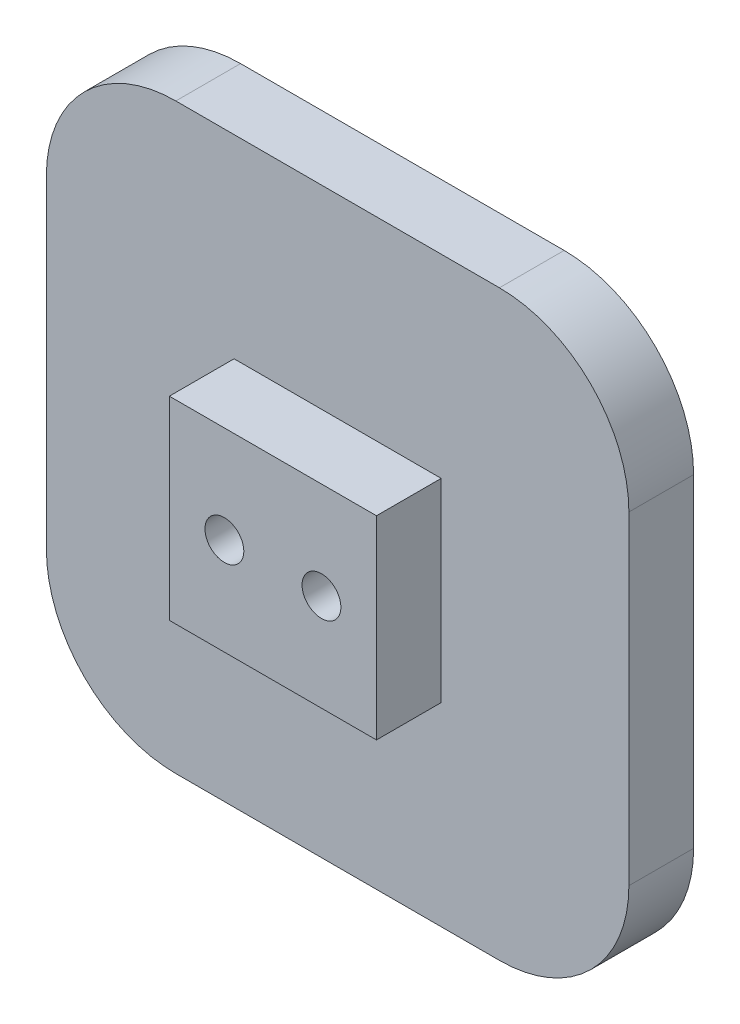
ISO-10303-21;
HEADER;
FILE_DESCRIPTION(('STEP AP214'),'2;1');
FILE_NAME('part.step','',(''),(''),'','','');
FILE_SCHEMA(('AUTOMOTIVE_DESIGN { 1 0 10303 214 1 1 1 1 }'));
ENDSEC;
DATA;
#1=APPLICATION_CONTEXT('core data for automotive mechanical design processes');
#2=APPLICATION_PROTOCOL_DEFINITION('international standard','automotive_design',2000,#1);
#3=PRODUCT_CONTEXT('',#1,'mechanical');
#4=PRODUCT('Part','Part','',(#3));
#5=PRODUCT_RELATED_PRODUCT_CATEGORY('part','',(#4));
#6=PRODUCT_DEFINITION_FORMATION('','',#4);
#7=PRODUCT_DEFINITION_CONTEXT('part definition',#1,'design');
#8=PRODUCT_DEFINITION('design','',#6,#7);
#9=PRODUCT_DEFINITION_SHAPE('','',#8);
#10=(LENGTH_UNIT() NAMED_UNIT(*) SI_UNIT(.MILLI.,.METRE.));
#11=(NAMED_UNIT(*) PLANE_ANGLE_UNIT() SI_UNIT($,.RADIAN.));
#12=(NAMED_UNIT(*) SI_UNIT($,.STERADIAN.) SOLID_ANGLE_UNIT());
#13=UNCERTAINTY_MEASURE_WITH_UNIT(LENGTH_MEASURE(1.E-05),#10,'distance_accuracy_value','');
#14=(GEOMETRIC_REPRESENTATION_CONTEXT(3) GLOBAL_UNCERTAINTY_ASSIGNED_CONTEXT((#13)) GLOBAL_UNIT_ASSIGNED_CONTEXT((#10,
#11,#12)) REPRESENTATION_CONTEXT('',''));
#15=CARTESIAN_POINT('',(0.,0.,0.));
#16=DIRECTION('',(0.,0.,1.));
#17=DIRECTION('',(1.,0.,0.));
#18=AXIS2_PLACEMENT_3D('',#15,#16,#17);
#19=CARTESIAN_POINT('',(-12.5413669644873,38.8891123439667,27.));
#20=DIRECTION('',(0.,1.,0.));
#21=DIRECTION('',(0.,0.,1.));
#22=AXIS2_PLACEMENT_3D('',#19,#20,#21);
#23=PLANE('',#22);
#24=DIRECTION('',(0.,0.,-1.));
#25=VECTOR('',#24,1.);
#26=CARTESIAN_POINT('',(19.4586330355127,38.8891123439667,27.));
#27=LINE('',#26,#25);
#28=CARTESIAN_POINT('',(19.4586330355127,38.8891123439667,20.));
#29=VERTEX_POINT('',#28);
#30=CARTESIAN_POINT('',(19.4586330355127,38.8891123439667,10.));
#31=VERTEX_POINT('',#30);
#32=EDGE_CURVE('E247',#29,#31,#27,.T.);
#33=ORIENTED_EDGE('',*,*,#32,.T.);
#34=DIRECTION('',(1.,0.,0.));
#35=VECTOR('',#34,1.);
#36=CARTESIAN_POINT('',(-12.5413669644873,38.8891123439667,10.));
#37=LINE('',#36,#35);
#38=CARTESIAN_POINT('',(-12.5413669644873,38.8891123439667,10.));
#39=VERTEX_POINT('',#38);
#40=EDGE_CURVE('E130',#39,#31,#37,.T.);
#41=ORIENTED_EDGE('',*,*,#40,.F.);
#42=DIRECTION('',(0.,0.,-1.));
#43=VECTOR('',#42,1.);
#44=CARTESIAN_POINT('',(-12.5413669644873,38.8891123439667,27.));
#45=LINE('',#44,#43);
#46=CARTESIAN_POINT('',(-12.5413669644873,38.8891123439667,20.));
#47=VERTEX_POINT('',#46);
#48=EDGE_CURVE('E249',#47,#39,#45,.T.);
#49=ORIENTED_EDGE('',*,*,#48,.F.);
#50=DIRECTION('',(1.,0.,0.));
#51=VECTOR('',#50,1.);
#52=CARTESIAN_POINT('',(28.4586330355127,38.8891123439667,20.));
#53=LINE('',#52,#51);
#54=EDGE_CURVE('E252',#47,#29,#53,.T.);
#55=ORIENTED_EDGE('',*,*,#54,.T.);
#56=EDGE_LOOP('',(#33,#41,#49,#55));
#57=FACE_BOUND('',#56,.T.);
#58=ADVANCED_FACE('F33',(#57),#23,.T.);
#59=CARTESIAN_POINT('',(28.4586330355127,48.8891123439667,0.));
#60=DIRECTION('',(0.,0.,-1.));
#61=DIRECTION('',(-1.,0.,0.));
#62=AXIS2_PLACEMENT_3D('',#59,#60,#61);
#63=PLANE('',#62);
#64=CARTESIAN_POINT('',(-4.04136696448732,23.8891123439667,0.));
#65=DIRECTION('',(0.,0.,1.));
#66=DIRECTION('',(1.,0.,0.));
#67=AXIS2_PLACEMENT_3D('',#64,#65,#66);
#68=CIRCLE('',#67,6.);
#69=CARTESIAN_POINT('',(1.95863303551269,23.8891123439667,0.));
#70=VERTEX_POINT('',#69);
#71=EDGE_CURVE('E187',#70,#70,#68,.T.);
#72=ORIENTED_EDGE('',*,*,#71,.T.);
#73=EDGE_LOOP('',(#72));
#74=FACE_BOUND('',#73,.T.);
#75=CARTESIAN_POINT('',(10.9586330355127,23.8891123439667,0.));
#76=DIRECTION('',(0.,0.,1.));
#77=DIRECTION('',(1.,0.,0.));
#78=AXIS2_PLACEMENT_3D('',#75,#76,#77);
#79=CIRCLE('',#78,6.);
#80=CARTESIAN_POINT('',(16.9586330355127,23.8891123439667,0.));
#81=VERTEX_POINT('',#80);
#82=EDGE_CURVE('E180',#81,#81,#79,.T.);
#83=ORIENTED_EDGE('',*,*,#82,.T.);
#84=EDGE_LOOP('',(#83));
#85=FACE_BOUND('',#84,.T.);
#86=CARTESIAN_POINT('',(28.4586330355126,-1.11088765603327,0.));
#87=DIRECTION('',(0.,0.,-1.));
#88=DIRECTION('',(1.,0.,0.));
#89=AXIS2_PLACEMENT_3D('',#86,#87,#88);
#90=CIRCLE('',#89,20.);
#91=CARTESIAN_POINT('',(48.4586330355126,-1.11088765603329,0.));
#92=VERTEX_POINT('',#91);
#93=CARTESIAN_POINT('',(28.4586330355126,-21.1108876560333,0.));
#94=VERTEX_POINT('',#93);
#95=EDGE_CURVE('E200',#92,#94,#90,.T.);
#96=ORIENTED_EDGE('',*,*,#95,.T.);
#97=DIRECTION('',(1.,0.,0.));
#98=VECTOR('',#97,1.);
#99=CARTESIAN_POINT('',(-21.5413669644873,-21.1108876560332,0.));
#100=LINE('',#99,#98);
#101=CARTESIAN_POINT('',(-21.5413669644874,-21.1108876560332,0.));
#102=VERTEX_POINT('',#101);
#103=EDGE_CURVE('E42',#102,#94,#100,.T.);
#104=ORIENTED_EDGE('',*,*,#103,.F.);
#105=CARTESIAN_POINT('',(-21.5413669644873,-1.11088765603323,0.));
#106=DIRECTION('',(0.,0.,-1.));
#107=DIRECTION('',(-1.,0.,0.));
#108=AXIS2_PLACEMENT_3D('',#105,#106,#107);
#109=CIRCLE('',#108,20.);
#110=CARTESIAN_POINT('',(-41.5413669644873,-1.11088765603322,0.));
#111=VERTEX_POINT('',#110);
#112=EDGE_CURVE('E140',#102,#111,#109,.T.);
#113=ORIENTED_EDGE('',*,*,#112,.T.);
#114=DIRECTION('',(0.,-1.,0.));
#115=VECTOR('',#114,1.);
#116=CARTESIAN_POINT('',(-41.5413669644873,68.8891123439667,0.));
#117=LINE('',#116,#115);
#118=CARTESIAN_POINT('',(-41.5413669644873,48.8891123439667,0.));
#119=VERTEX_POINT('',#118);
#120=EDGE_CURVE('E161',#119,#111,#117,.T.);
#121=ORIENTED_EDGE('',*,*,#120,.F.);
#122=CARTESIAN_POINT('',(-21.5413669644873,48.8891123439667,0.));
#123=DIRECTION('',(0.,0.,-1.));
#124=DIRECTION('',(1.,0.,0.));
#125=AXIS2_PLACEMENT_3D('',#122,#123,#124);
#126=CIRCLE('',#125,20.);
#127=CARTESIAN_POINT('',(-21.5413669644873,68.8891123439667,0.));
#128=VERTEX_POINT('',#127);
#129=EDGE_CURVE('E223',#119,#128,#126,.T.);
#130=ORIENTED_EDGE('',*,*,#129,.T.);
#131=DIRECTION('',(-1.,0.,0.));
#132=VECTOR('',#131,1.);
#133=CARTESIAN_POINT('',(-21.5413669644873,68.8891123439667,0.));
#134=LINE('',#133,#132);
#135=CARTESIAN_POINT('',(28.4586330355127,68.8891123439667,0.));
#136=VERTEX_POINT('',#135);
#137=EDGE_CURVE('E255',#136,#128,#134,.T.);
#138=ORIENTED_EDGE('',*,*,#137,.F.);
#139=CARTESIAN_POINT('',(28.4586330355127,48.8891123439667,0.));
#140=DIRECTION('',(0.,0.,-1.));
#141=DIRECTION('',(-1.,0.,0.));
#142=AXIS2_PLACEMENT_3D('',#139,#140,#141);
#143=CIRCLE('',#142,20.);
#144=CARTESIAN_POINT('',(48.4586330355127,48.8891123439667,0.));
#145=VERTEX_POINT('',#144);
#146=EDGE_CURVE('E211',#136,#145,#143,.T.);
#147=ORIENTED_EDGE('',*,*,#146,.T.);
#148=DIRECTION('',(0.,1.,0.));
#149=VECTOR('',#148,1.);
#150=CARTESIAN_POINT('',(48.4586330355127,68.8891123439667,0.));
#151=LINE('',#150,#149);
#152=EDGE_CURVE('E146',#92,#145,#151,.T.);
#153=ORIENTED_EDGE('',*,*,#152,.F.);
#154=EDGE_LOOP('',(#96,#104,#113,#121,#130,#138,#147,#153));
#155=FACE_BOUND('',#154,.T.);
#156=ADVANCED_FACE('F240',(#74,#85,#155),#63,.T.);
#157=CARTESIAN_POINT('',(-12.5413669644873,68.8891123439667,30.));
#158=DIRECTION('',(-1.,0.,0.));
#159=DIRECTION('',(0.,0.,1.));
#160=AXIS2_PLACEMENT_3D('',#157,#158,#159);
#161=PLANE('',#160);
#162=DIRECTION('',(0.,1.,0.));
#163=VECTOR('',#162,1.);
#164=CARTESIAN_POINT('',(-12.5413669644873,68.8891123439667,10.));
#165=LINE('',#164,#163);
#166=CARTESIAN_POINT('',(-12.5413669644873,8.88911234396675,10.));
#167=VERTEX_POINT('',#166);
#168=EDGE_CURVE('E167',#167,#39,#165,.T.);
#169=ORIENTED_EDGE('',*,*,#168,.F.);
#170=DIRECTION('',(0.,0.,-1.));
#171=VECTOR('',#170,1.);
#172=CARTESIAN_POINT('',(-12.5413669644873,8.88911234396675,28.));
#173=LINE('',#172,#171);
#174=CARTESIAN_POINT('',(-12.5413669644873,8.88911234396675,20.));
#175=VERTEX_POINT('',#174);
#176=EDGE_CURVE('E125',#175,#167,#173,.T.);
#177=ORIENTED_EDGE('',*,*,#176,.F.);
#178=DIRECTION('',(0.,1.,0.));
#179=VECTOR('',#178,1.);
#180=CARTESIAN_POINT('',(-12.5413669644873,48.8891123439667,20.));
#181=LINE('',#180,#179);
#182=EDGE_CURVE('E245',#175,#47,#181,.T.);
#183=ORIENTED_EDGE('',*,*,#182,.T.);
#184=ORIENTED_EDGE('',*,*,#48,.T.);
#185=EDGE_LOOP('',(#169,#177,#183,#184));
#186=FACE_BOUND('',#185,.T.);
#187=ADVANCED_FACE('F295',(#186),#161,.T.);
#188=CARTESIAN_POINT('',(19.4586330355127,68.8891123439667,30.));
#189=DIRECTION('',(1.,0.,0.));
#190=DIRECTION('',(0.,0.,-1.));
#191=AXIS2_PLACEMENT_3D('',#188,#189,#190);
#192=PLANE('',#191);
#193=DIRECTION('',(0.,-1.,0.));
#194=VECTOR('',#193,1.);
#195=CARTESIAN_POINT('',(19.4586330355127,48.8891123439667,20.));
#196=LINE('',#195,#194);
#197=CARTESIAN_POINT('',(19.4586330355127,8.88911234396675,20.));
#198=VERTEX_POINT('',#197);
#199=EDGE_CURVE('E139',#29,#198,#196,.T.);
#200=ORIENTED_EDGE('',*,*,#199,.T.);
#201=DIRECTION('',(0.,0.,-1.));
#202=VECTOR('',#201,1.);
#203=CARTESIAN_POINT('',(19.4586330355127,8.88911234396675,28.));
#204=LINE('',#203,#202);
#205=CARTESIAN_POINT('',(19.4586330355127,8.88911234396675,10.));
#206=VERTEX_POINT('',#205);
#207=EDGE_CURVE('E49',#198,#206,#204,.T.);
#208=ORIENTED_EDGE('',*,*,#207,.T.);
#209=DIRECTION('',(0.,-1.,0.));
#210=VECTOR('',#209,1.);
#211=CARTESIAN_POINT('',(19.4586330355127,68.8891123439667,10.));
#212=LINE('',#211,#210);
#213=EDGE_CURVE('E137',#31,#206,#212,.T.);
#214=ORIENTED_EDGE('',*,*,#213,.F.);
#215=ORIENTED_EDGE('',*,*,#32,.F.);
#216=EDGE_LOOP('',(#200,#208,#214,#215));
#217=FACE_BOUND('',#216,.T.);
#218=ADVANCED_FACE('F136',(#217),#192,.T.);
#219=CARTESIAN_POINT('',(-21.5413669644873,-21.1108876560332,20.));
#220=DIRECTION('',(0.,1.,0.));
#221=DIRECTION('',(0.,0.,1.));
#222=AXIS2_PLACEMENT_3D('',#219,#220,#221);
#223=PLANE('',#222);
#224=DIRECTION('',(1.,0.,0.));
#225=VECTOR('',#224,1.);
#226=CARTESIAN_POINT('',(48.4586330355127,-21.1108876560332,10.));
#227=LINE('',#226,#225);
#228=CARTESIAN_POINT('',(-21.5413669644874,-21.1108876560332,10.));
#229=VERTEX_POINT('',#228);
#230=CARTESIAN_POINT('',(28.4586330355126,-21.1108876560332,10.));
#231=VERTEX_POINT('',#230);
#232=EDGE_CURVE('E145',#229,#231,#227,.T.);
#233=ORIENTED_EDGE('',*,*,#232,.F.);
#234=DIRECTION('',(0.,0.,-1.));
#235=VECTOR('',#234,1.);
#236=CARTESIAN_POINT('',(-21.5413669644874,-21.1108876560332,10.));
#237=LINE('',#236,#235);
#238=EDGE_CURVE('E193',#229,#102,#237,.T.);
#239=ORIENTED_EDGE('',*,*,#238,.T.);
#240=ORIENTED_EDGE('',*,*,#103,.T.);
#241=DIRECTION('',(0.,0.,-1.));
#242=VECTOR('',#241,1.);
#243=CARTESIAN_POINT('',(28.4586330355126,-21.1108876560333,10.));
#244=LINE('',#243,#242);
#245=EDGE_CURVE('E208',#231,#94,#244,.T.);
#246=ORIENTED_EDGE('',*,*,#245,.F.);
#247=EDGE_LOOP('',(#233,#239,#240,#246));
#248=FACE_BOUND('',#247,.T.);
#249=ADVANCED_FACE('F277',(#248),#223,.F.);
#250=CARTESIAN_POINT('',(28.4586330355127,48.8891123439667,20.));
#251=DIRECTION('',(0.,0.,-1.));
#252=DIRECTION('',(-1.,0.,0.));
#253=AXIS2_PLACEMENT_3D('',#250,#251,#252);
#254=PLANE('',#253);
#255=CARTESIAN_POINT('',(10.9586330355127,23.8891123439667,20.));
#256=DIRECTION('',(0.,0.,-1.));
#257=DIRECTION('',(-1.,0.,0.));
#258=AXIS2_PLACEMENT_3D('',#255,#256,#257);
#259=CIRCLE('',#258,3.);
#260=CARTESIAN_POINT('',(7.95863303551268,23.8891123439667,20.));
#261=VERTEX_POINT('',#260);
#262=EDGE_CURVE('E172',#261,#261,#259,.F.);
#263=ORIENTED_EDGE('',*,*,#262,.F.);
#264=EDGE_LOOP('',(#263));
#265=FACE_BOUND('',#264,.T.);
#266=CARTESIAN_POINT('',(-4.04136696448732,23.8891123439667,20.));
#267=DIRECTION('',(0.,0.,-1.));
#268=DIRECTION('',(-1.,0.,0.));
#269=AXIS2_PLACEMENT_3D('',#266,#267,#268);
#270=CIRCLE('',#269,3.);
#271=CARTESIAN_POINT('',(-7.04136696448732,23.8891123439667,20.));
#272=VERTEX_POINT('',#271);
#273=EDGE_CURVE('E131',#272,#272,#270,.F.);
#274=ORIENTED_EDGE('',*,*,#273,.F.);
#275=EDGE_LOOP('',(#274));
#276=FACE_BOUND('',#275,.T.);
#277=DIRECTION('',(-1.,0.,0.));
#278=VECTOR('',#277,1.);
#279=CARTESIAN_POINT('',(28.4586330355127,8.88911234396675,20.));
#280=LINE('',#279,#278);
#281=EDGE_CURVE('E11',#198,#175,#280,.T.);
#282=ORIENTED_EDGE('',*,*,#281,.F.);
#283=ORIENTED_EDGE('',*,*,#199,.F.);
#284=ORIENTED_EDGE('',*,*,#54,.F.);
#285=ORIENTED_EDGE('',*,*,#182,.F.);
#286=EDGE_LOOP('',(#282,#283,#284,#285));
#287=FACE_BOUND('',#286,.T.);
#288=ADVANCED_FACE('F301',(#265,#276,#287),#254,.F.);
#289=CARTESIAN_POINT('',(-21.5413669644873,68.8891123439667,20.));
#290=DIRECTION('',(0.,-1.,0.));
#291=DIRECTION('',(0.,0.,-1.));
#292=AXIS2_PLACEMENT_3D('',#289,#290,#291);
#293=PLANE('',#292);
#294=ORIENTED_EDGE('',*,*,#137,.T.);
#295=DIRECTION('',(0.,0.,-1.));
#296=VECTOR('',#295,1.);
#297=CARTESIAN_POINT('',(-21.5413669644873,68.8891123439667,10.));
#298=LINE('',#297,#296);
#299=CARTESIAN_POINT('',(-21.5413669644873,68.8891123439667,10.));
#300=VERTEX_POINT('',#299);
#301=EDGE_CURVE('E226',#300,#128,#298,.T.);
#302=ORIENTED_EDGE('',*,*,#301,.F.);
#303=DIRECTION('',(-1.,0.,0.));
#304=VECTOR('',#303,1.);
#305=CARTESIAN_POINT('',(-41.5413669644873,68.8891123439667,10.));
#306=LINE('',#305,#304);
#307=CARTESIAN_POINT('',(28.4586330355127,68.8891123439667,10.));
#308=VERTEX_POINT('',#307);
#309=EDGE_CURVE('E169',#308,#300,#306,.T.);
#310=ORIENTED_EDGE('',*,*,#309,.F.);
#311=DIRECTION('',(0.,0.,-1.));
#312=VECTOR('',#311,1.);
#313=CARTESIAN_POINT('',(28.4586330355127,68.8891123439667,10.));
#314=LINE('',#313,#312);
#315=EDGE_CURVE('E215',#308,#136,#314,.T.);
#316=ORIENTED_EDGE('',*,*,#315,.T.);
#317=EDGE_LOOP('',(#294,#302,#310,#316));
#318=FACE_BOUND('',#317,.T.);
#319=ADVANCED_FACE('F35',(#318),#293,.F.);
#320=CARTESIAN_POINT('',(-41.5413669644873,68.8891123439667,10.));
#321=DIRECTION('',(1.,0.,0.));
#322=DIRECTION('',(0.,0.,-1.));
#323=AXIS2_PLACEMENT_3D('',#320,#321,#322);
#324=PLANE('',#323);
#325=DIRECTION('',(0.,0.,-1.));
#326=VECTOR('',#325,1.);
#327=CARTESIAN_POINT('',(-41.5413669644873,-1.11088765603322,10.));
#328=LINE('',#327,#326);
#329=CARTESIAN_POINT('',(-41.5413669644873,-1.11088765603319,10.));
#330=VERTEX_POINT('',#329);
#331=EDGE_CURVE('E198',#330,#111,#328,.T.);
#332=ORIENTED_EDGE('',*,*,#331,.F.);
#333=DIRECTION('',(0.,-1.,0.));
#334=VECTOR('',#333,1.);
#335=CARTESIAN_POINT('',(-41.5413669644873,68.8891123439667,10.));
#336=LINE('',#335,#334);
#337=CARTESIAN_POINT('',(-41.5413669644873,48.8891123439667,10.));
#338=VERTEX_POINT('',#337);
#339=EDGE_CURVE('E165',#338,#330,#336,.T.);
#340=ORIENTED_EDGE('',*,*,#339,.F.);
#341=DIRECTION('',(0.,0.,-1.));
#342=VECTOR('',#341,1.);
#343=CARTESIAN_POINT('',(-41.5413669644873,48.8891123439667,10.));
#344=LINE('',#343,#342);
#345=EDGE_CURVE('E151',#338,#119,#344,.T.);
#346=ORIENTED_EDGE('',*,*,#345,.T.);
#347=ORIENTED_EDGE('',*,*,#120,.T.);
#348=EDGE_LOOP('',(#332,#340,#346,#347));
#349=FACE_BOUND('',#348,.T.);
#350=ADVANCED_FACE('F236',(#349),#324,.F.);
#351=CARTESIAN_POINT('',(0.,0.,10.));
#352=DIRECTION('',(0.,0.,-1.));
#353=DIRECTION('',(-1.,0.,0.));
#354=AXIS2_PLACEMENT_3D('',#351,#352,#353);
#355=PLANE('',#354);
#356=DIRECTION('',(-1.,0.,0.));
#357=VECTOR('',#356,1.);
#358=CARTESIAN_POINT('',(-12.5413669644873,8.88911234396675,10.));
#359=LINE('',#358,#357);
#360=EDGE_CURVE('E122',#206,#167,#359,.T.);
#361=ORIENTED_EDGE('',*,*,#360,.T.);
#362=ORIENTED_EDGE('',*,*,#168,.T.);
#363=ORIENTED_EDGE('',*,*,#40,.T.);
#364=ORIENTED_EDGE('',*,*,#213,.T.);
#365=EDGE_LOOP('',(#361,#362,#363,#364));
#366=FACE_BOUND('',#365,.T.);
#367=CARTESIAN_POINT('',(28.4586330355126,-1.11088765603327,10.));
#368=DIRECTION('',(0.,0.,-1.));
#369=DIRECTION('',(1.,0.,0.));
#370=AXIS2_PLACEMENT_3D('',#367,#368,#369);
#371=CIRCLE('',#370,20.);
#372=CARTESIAN_POINT('',(48.4586330355126,-1.11088765603329,10.));
#373=VERTEX_POINT('',#372);
#374=EDGE_CURVE('E201',#373,#231,#371,.T.);
#375=ORIENTED_EDGE('',*,*,#374,.F.);
#376=DIRECTION('',(0.,1.,0.));
#377=VECTOR('',#376,1.);
#378=CARTESIAN_POINT('',(48.4586330355127,68.8891123439667,10.));
#379=LINE('',#378,#377);
#380=CARTESIAN_POINT('',(48.4586330355127,48.8891123439667,10.));
#381=VERTEX_POINT('',#380);
#382=EDGE_CURVE('E149',#373,#381,#379,.T.);
#383=ORIENTED_EDGE('',*,*,#382,.T.);
#384=CARTESIAN_POINT('',(28.4586330355127,48.8891123439667,10.));
#385=DIRECTION('',(0.,0.,-1.));
#386=DIRECTION('',(-1.,0.,0.));
#387=AXIS2_PLACEMENT_3D('',#384,#385,#386);
#388=CIRCLE('',#387,20.);
#389=EDGE_CURVE('E212',#308,#381,#388,.T.);
#390=ORIENTED_EDGE('',*,*,#389,.F.);
#391=ORIENTED_EDGE('',*,*,#309,.T.);
#392=CARTESIAN_POINT('',(-21.5413669644873,48.8891123439667,10.));
#393=DIRECTION('',(0.,0.,-1.));
#394=DIRECTION('',(1.,0.,0.));
#395=AXIS2_PLACEMENT_3D('',#392,#393,#394);
#396=CIRCLE('',#395,20.);
#397=EDGE_CURVE('E224',#338,#300,#396,.T.);
#398=ORIENTED_EDGE('',*,*,#397,.F.);
#399=ORIENTED_EDGE('',*,*,#339,.T.);
#400=CARTESIAN_POINT('',(-21.5413669644873,-1.11088765603323,10.));
#401=DIRECTION('',(0.,0.,-1.));
#402=DIRECTION('',(-1.,0.,0.));
#403=AXIS2_PLACEMENT_3D('',#400,#401,#402);
#404=CIRCLE('',#403,20.);
#405=EDGE_CURVE('E57',#229,#330,#404,.T.);
#406=ORIENTED_EDGE('',*,*,#405,.F.);
#407=ORIENTED_EDGE('',*,*,#232,.T.);
#408=EDGE_LOOP('',(#375,#383,#390,#391,#398,#399,#406,#407));
#409=FACE_BOUND('',#408,.T.);
#410=ADVANCED_FACE('F142',(#366,#409),#355,.F.);
#411=CARTESIAN_POINT('',(48.4586330355127,68.8891123439667,10.));
#412=DIRECTION('',(-1.,0.,0.));
#413=DIRECTION('',(0.,0.,1.));
#414=AXIS2_PLACEMENT_3D('',#411,#412,#413);
#415=PLANE('',#414);
#416=ORIENTED_EDGE('',*,*,#382,.F.);
#417=DIRECTION('',(0.,0.,-1.));
#418=VECTOR('',#417,1.);
#419=CARTESIAN_POINT('',(48.4586330355126,-1.11088765603329,10.));
#420=LINE('',#419,#418);
#421=EDGE_CURVE('E203',#373,#92,#420,.T.);
#422=ORIENTED_EDGE('',*,*,#421,.T.);
#423=ORIENTED_EDGE('',*,*,#152,.T.);
#424=DIRECTION('',(0.,0.,-1.));
#425=VECTOR('',#424,1.);
#426=CARTESIAN_POINT('',(48.4586330355127,48.8891123439667,10.));
#427=LINE('',#426,#425);
#428=EDGE_CURVE('E220',#381,#145,#427,.T.);
#429=ORIENTED_EDGE('',*,*,#428,.F.);
#430=EDGE_LOOP('',(#416,#422,#423,#429));
#431=FACE_BOUND('',#430,.T.);
#432=ADVANCED_FACE('F272',(#431),#415,.F.);
#433=CARTESIAN_POINT('',(-21.5413669644873,48.8891123439667,10.));
#434=DIRECTION('',(0.,0.,-1.));
#435=DIRECTION('',(-1.,0.,0.));
#436=AXIS2_PLACEMENT_3D('',#433,#434,#435);
#437=CYLINDRICAL_SURFACE('',#436,20.);
#438=ORIENTED_EDGE('',*,*,#129,.F.);
#439=ORIENTED_EDGE('',*,*,#345,.F.);
#440=ORIENTED_EDGE('',*,*,#397,.T.);
#441=ORIENTED_EDGE('',*,*,#301,.T.);
#442=EDGE_LOOP('',(#438,#439,#440,#441));
#443=FACE_BOUND('',#442,.T.);
#444=ADVANCED_FACE('F263',(#443),#437,.T.);
#445=CARTESIAN_POINT('',(28.4586330355127,48.8891123439667,10.));
#446=DIRECTION('',(0.,0.,-1.));
#447=DIRECTION('',(-1.,0.,0.));
#448=AXIS2_PLACEMENT_3D('',#445,#446,#447);
#449=CYLINDRICAL_SURFACE('',#448,20.);
#450=ORIENTED_EDGE('',*,*,#146,.F.);
#451=ORIENTED_EDGE('',*,*,#315,.F.);
#452=ORIENTED_EDGE('',*,*,#389,.T.);
#453=ORIENTED_EDGE('',*,*,#428,.T.);
#454=EDGE_LOOP('',(#450,#451,#452,#453));
#455=FACE_BOUND('',#454,.T.);
#456=ADVANCED_FACE('F268',(#455),#449,.T.);
#457=CARTESIAN_POINT('',(28.4586330355126,-1.11088765603327,10.));
#458=DIRECTION('',(0.,0.,-1.));
#459=DIRECTION('',(-1.,0.,0.));
#460=AXIS2_PLACEMENT_3D('',#457,#458,#459);
#461=CYLINDRICAL_SURFACE('',#460,20.);
#462=ORIENTED_EDGE('',*,*,#95,.F.);
#463=ORIENTED_EDGE('',*,*,#421,.F.);
#464=ORIENTED_EDGE('',*,*,#374,.T.);
#465=ORIENTED_EDGE('',*,*,#245,.T.);
#466=EDGE_LOOP('',(#462,#463,#464,#465));
#467=FACE_BOUND('',#466,.T.);
#468=ADVANCED_FACE('F274',(#467),#461,.T.);
#469=CARTESIAN_POINT('',(-21.5413669644873,-1.11088765603323,10.));
#470=DIRECTION('',(0.,0.,-1.));
#471=DIRECTION('',(-1.,0.,0.));
#472=AXIS2_PLACEMENT_3D('',#469,#470,#471);
#473=CYLINDRICAL_SURFACE('',#472,20.);
#474=ORIENTED_EDGE('',*,*,#112,.F.);
#475=ORIENTED_EDGE('',*,*,#238,.F.);
#476=ORIENTED_EDGE('',*,*,#405,.T.);
#477=ORIENTED_EDGE('',*,*,#331,.T.);
#478=EDGE_LOOP('',(#474,#475,#476,#477));
#479=FACE_BOUND('',#478,.T.);
#480=ADVANCED_FACE('F278',(#479),#473,.T.);
#481=CARTESIAN_POINT('',(-12.5413669644873,8.88911234396675,28.));
#482=DIRECTION('',(0.,-1.,0.));
#483=DIRECTION('',(0.,0.,-1.));
#484=AXIS2_PLACEMENT_3D('',#481,#482,#483);
#485=PLANE('',#484);
#486=ORIENTED_EDGE('',*,*,#360,.F.);
#487=ORIENTED_EDGE('',*,*,#207,.F.);
#488=ORIENTED_EDGE('',*,*,#281,.T.);
#489=ORIENTED_EDGE('',*,*,#176,.T.);
#490=EDGE_LOOP('',(#486,#487,#488,#489));
#491=FACE_BOUND('',#490,.T.);
#492=ADVANCED_FACE('F123',(#491),#485,.T.);
#493=CARTESIAN_POINT('',(-4.04136696448732,23.8891123439667,22.));
#494=DIRECTION('',(0.,0.,-1.));
#495=DIRECTION('',(-1.,0.,0.));
#496=AXIS2_PLACEMENT_3D('',#493,#494,#495);
#497=CYLINDRICAL_SURFACE('',#496,3.);
#498=CARTESIAN_POINT('',(-4.04136696448732,23.8891123439667,5.));
#499=DIRECTION('',(0.,0.,1.));
#500=DIRECTION('',(1.,0.,0.));
#501=AXIS2_PLACEMENT_3D('',#498,#499,#500);
#502=CIRCLE('',#501,3.);
#503=CARTESIAN_POINT('',(-1.04136696448732,23.8891123439667,5.));
#504=VERTEX_POINT('',#503);
#505=EDGE_CURVE('E37',#504,#504,#502,.T.);
#506=ORIENTED_EDGE('',*,*,#505,.F.);
#507=EDGE_LOOP('',(#506));
#508=FACE_BOUND('',#507,.T.);
#509=ORIENTED_EDGE('',*,*,#273,.T.);
#510=EDGE_LOOP('',(#509));
#511=FACE_BOUND('',#510,.T.);
#512=ADVANCED_FACE('F285',(#508,#511),#497,.F.);
#513=CARTESIAN_POINT('',(10.9586330355127,23.8891123439667,22.));
#514=DIRECTION('',(0.,0.,-1.));
#515=DIRECTION('',(-1.,0.,0.));
#516=AXIS2_PLACEMENT_3D('',#513,#514,#515);
#517=CYLINDRICAL_SURFACE('',#516,3.);
#518=CARTESIAN_POINT('',(10.9586330355127,23.8891123439667,5.));
#519=DIRECTION('',(0.,0.,1.));
#520=DIRECTION('',(1.,0.,0.));
#521=AXIS2_PLACEMENT_3D('',#518,#519,#520);
#522=CIRCLE('',#521,3.);
#523=CARTESIAN_POINT('',(13.9586330355127,23.8891123439667,5.));
#524=VERTEX_POINT('',#523);
#525=EDGE_CURVE('E174',#524,#524,#522,.T.);
#526=ORIENTED_EDGE('',*,*,#525,.F.);
#527=EDGE_LOOP('',(#526));
#528=FACE_BOUND('',#527,.T.);
#529=ORIENTED_EDGE('',*,*,#262,.T.);
#530=EDGE_LOOP('',(#529));
#531=FACE_BOUND('',#530,.T.);
#532=ADVANCED_FACE('F398',(#528,#531),#517,.F.);
#533=CARTESIAN_POINT('',(10.9586330355127,23.8891123439667,5.));
#534=DIRECTION('',(0.,0.,-1.));
#535=DIRECTION('',(-1.,0.,0.));
#536=AXIS2_PLACEMENT_3D('',#533,#534,#535);
#537=CYLINDRICAL_SURFACE('',#536,6.);
#538=CARTESIAN_POINT('',(10.9586330355127,23.8891123439667,5.));
#539=DIRECTION('',(0.,0.,1.));
#540=DIRECTION('',(1.,0.,0.));
#541=AXIS2_PLACEMENT_3D('',#538,#539,#540);
#542=CIRCLE('',#541,6.);
#543=CARTESIAN_POINT('',(16.9586330355127,23.8891123439667,5.));
#544=VERTEX_POINT('',#543);
#545=EDGE_CURVE('E176',#544,#544,#542,.T.);
#546=ORIENTED_EDGE('',*,*,#545,.T.);
#547=EDGE_LOOP('',(#546));
#548=FACE_BOUND('',#547,.T.);
#549=ORIENTED_EDGE('',*,*,#82,.F.);
#550=EDGE_LOOP('',(#549));
#551=FACE_BOUND('',#550,.T.);
#552=ADVANCED_FACE('F405',(#548,#551),#537,.F.);
#553=CARTESIAN_POINT('',(10.9586330355127,23.8891123439667,5.));
#554=DIRECTION('',(0.,0.,1.));
#555=DIRECTION('',(1.,0.,0.));
#556=AXIS2_PLACEMENT_3D('',#553,#554,#555);
#557=PLANE('',#556);
#558=ORIENTED_EDGE('',*,*,#525,.T.);
#559=EDGE_LOOP('',(#558));
#560=FACE_BOUND('',#559,.T.);
#561=ORIENTED_EDGE('',*,*,#545,.F.);
#562=EDGE_LOOP('',(#561));
#563=FACE_BOUND('',#562,.T.);
#564=ADVANCED_FACE('F414',(#560,#563),#557,.F.);
#565=CARTESIAN_POINT('',(-4.04136696448732,23.8891123439667,5.));
#566=DIRECTION('',(0.,0.,-1.));
#567=DIRECTION('',(-1.,0.,0.));
#568=AXIS2_PLACEMENT_3D('',#565,#566,#567);
#569=CYLINDRICAL_SURFACE('',#568,6.);
#570=CARTESIAN_POINT('',(-4.04136696448732,23.8891123439667,5.));
#571=DIRECTION('',(0.,0.,1.));
#572=DIRECTION('',(1.,0.,0.));
#573=AXIS2_PLACEMENT_3D('',#570,#571,#572);
#574=CIRCLE('',#573,6.);
#575=CARTESIAN_POINT('',(1.95863303551269,23.8891123439667,5.));
#576=VERTEX_POINT('',#575);
#577=EDGE_CURVE('E451',#576,#576,#574,.T.);
#578=ORIENTED_EDGE('',*,*,#577,.T.);
#579=EDGE_LOOP('',(#578));
#580=FACE_BOUND('',#579,.T.);
#581=ORIENTED_EDGE('',*,*,#71,.F.);
#582=EDGE_LOOP('',(#581));
#583=FACE_BOUND('',#582,.T.);
#584=ADVANCED_FACE('F423',(#580,#583),#569,.F.);
#585=CARTESIAN_POINT('',(-4.04136696448732,23.8891123439667,5.));
#586=DIRECTION('',(0.,0.,1.));
#587=DIRECTION('',(1.,0.,0.));
#588=AXIS2_PLACEMENT_3D('',#585,#586,#587);
#589=PLANE('',#588);
#590=ORIENTED_EDGE('',*,*,#505,.T.);
#591=EDGE_LOOP('',(#590));
#592=FACE_BOUND('',#591,.T.);
#593=ORIENTED_EDGE('',*,*,#577,.F.);
#594=EDGE_LOOP('',(#593));
#595=FACE_BOUND('',#594,.T.);
#596=ADVANCED_FACE('F432',(#592,#595),#589,.F.);
#597=CLOSED_SHELL('',(#58,#156,#187,#218,#249,#288,#319,#350,#410,#432,#444,#456,#468,#480,#492,
#512,#532,#552,#564,#584,#596));
#598=MANIFOLD_SOLID_BREP('B2',#597);
#599=ADVANCED_BREP_SHAPE_REPRESENTATION('',(#18,#598),#14);
#600=SHAPE_DEFINITION_REPRESENTATION(#9,#599);
ENDSEC;
END-ISO-10303-21;
